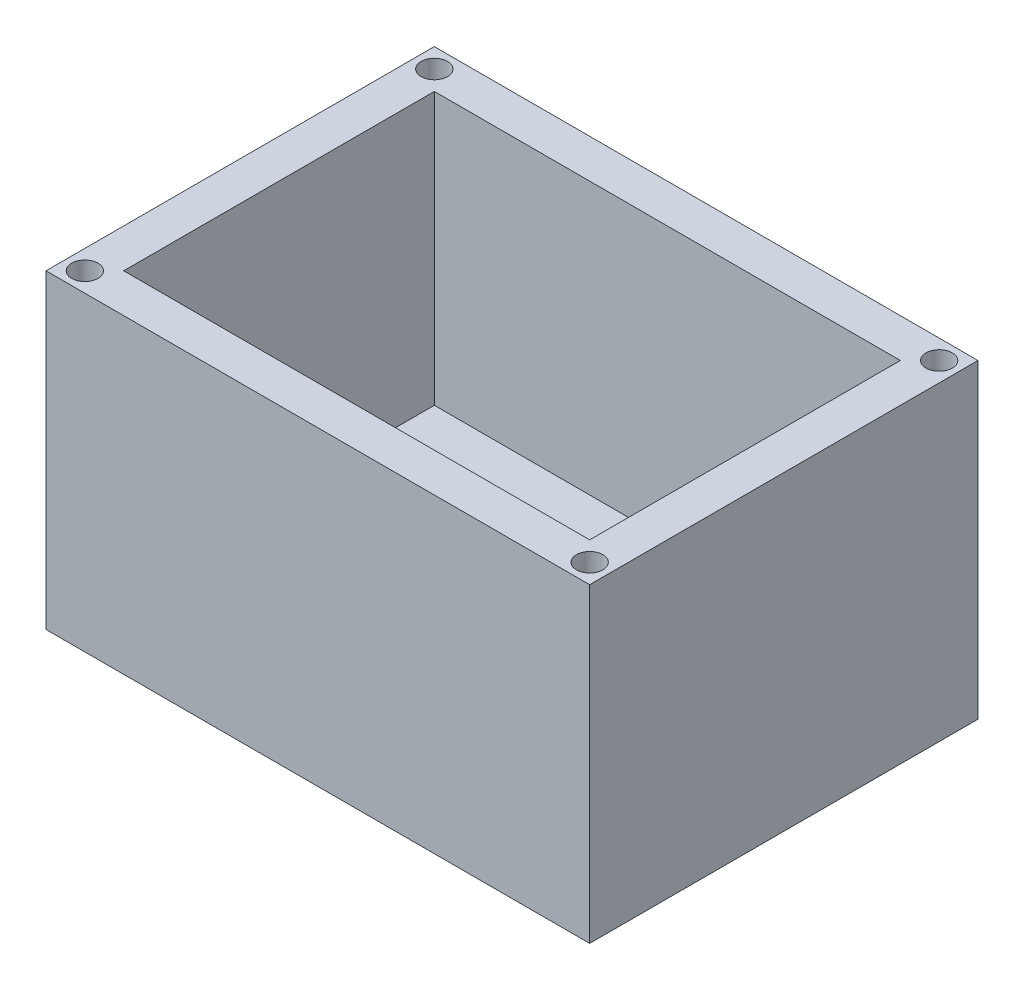
ISO-10303-21;
HEADER;
FILE_DESCRIPTION(('STEP AP214'),'2;1');
FILE_NAME('part.step','',(''),(''),'','','');
FILE_SCHEMA(('AUTOMOTIVE_DESIGN { 1 0 10303 214 1 1 1 1 }'));
ENDSEC;
DATA;
#1=APPLICATION_CONTEXT('core data for automotive mechanical design processes');
#2=APPLICATION_PROTOCOL_DEFINITION('international standard','automotive_design',2000,#1);
#3=PRODUCT_CONTEXT('',#1,'mechanical');
#4=PRODUCT('Part','Part','',(#3));
#5=PRODUCT_RELATED_PRODUCT_CATEGORY('part','',(#4));
#6=PRODUCT_DEFINITION_FORMATION('','',#4);
#7=PRODUCT_DEFINITION_CONTEXT('part definition',#1,'design');
#8=PRODUCT_DEFINITION('design','',#6,#7);
#9=PRODUCT_DEFINITION_SHAPE('','',#8);
#10=(LENGTH_UNIT() NAMED_UNIT(*) SI_UNIT(.MILLI.,.METRE.));
#11=(NAMED_UNIT(*) PLANE_ANGLE_UNIT() SI_UNIT($,.RADIAN.));
#12=(NAMED_UNIT(*) SI_UNIT($,.STERADIAN.) SOLID_ANGLE_UNIT());
#13=UNCERTAINTY_MEASURE_WITH_UNIT(LENGTH_MEASURE(1.E-05),#10,'distance_accuracy_value','');
#14=(GEOMETRIC_REPRESENTATION_CONTEXT(3) GLOBAL_UNCERTAINTY_ASSIGNED_CONTEXT((#13)) GLOBAL_UNIT_ASSIGNED_CONTEXT((#10,
#11,#12)) REPRESENTATION_CONTEXT('',''));
#15=CARTESIAN_POINT('',(0.,0.,0.));
#16=DIRECTION('',(0.,0.,1.));
#17=DIRECTION('',(1.,0.,0.));
#18=AXIS2_PLACEMENT_3D('',#15,#16,#17);
#19=CARTESIAN_POINT('',(0.,40.,0.));
#20=DIRECTION('',(0.,-1.,0.));
#21=DIRECTION('',(0.,0.,-1.));
#22=AXIS2_PLACEMENT_3D('',#19,#20,#21);
#23=PLANE('',#22);
#24=CARTESIAN_POINT('',(-22.4817193008492,40.,-11.7813638933177));
#25=DIRECTION('',(0.,1.,0.));
#26=DIRECTION('',(0.,0.,1.));
#27=AXIS2_PLACEMENT_3D('',#24,#25,#26);
#28=CIRCLE('',#27,1.7);
#29=CARTESIAN_POINT('',(-22.4817193008492,40.,-10.0813638933177));
#30=VERTEX_POINT('',#29);
#31=EDGE_CURVE('E129',#30,#30,#28,.T.);
#32=ORIENTED_EDGE('',*,*,#31,.F.);
#33=EDGE_LOOP('',(#32));
#34=FACE_BOUND('',#33,.T.);
#35=CARTESIAN_POINT('',(42.5182718238463,40.,-11.7813641264661));
#36=DIRECTION('',(0.,1.,0.));
#37=DIRECTION('',(0.,0.,1.));
#38=AXIS2_PLACEMENT_3D('',#35,#36,#37);
#39=CIRCLE('',#38,1.7);
#40=CARTESIAN_POINT('',(42.5182718238463,40.,-10.0813641264661));
#41=VERTEX_POINT('',#40);
#42=EDGE_CURVE('E128',#41,#41,#39,.T.);
#43=ORIENTED_EDGE('',*,*,#42,.F.);
#44=EDGE_LOOP('',(#43));
#45=FACE_BOUND('',#44,.T.);
#46=CARTESIAN_POINT('',(42.5182807559897,40.,33.2186374069588));
#47=DIRECTION('',(0.,1.,0.));
#48=DIRECTION('',(0.,0.,1.));
#49=AXIS2_PLACEMENT_3D('',#46,#47,#48);
#50=CIRCLE('',#49,1.7);
#51=CARTESIAN_POINT('',(42.5182807559897,40.,34.9186374069588));
#52=VERTEX_POINT('',#51);
#53=EDGE_CURVE('E142',#52,#52,#50,.T.);
#54=ORIENTED_EDGE('',*,*,#53,.F.);
#55=EDGE_LOOP('',(#54));
#56=FACE_BOUND('',#55,.T.);
#57=CARTESIAN_POINT('',(-22.4817182633575,40.,33.2186380861719));
#58=DIRECTION('',(0.,1.,0.));
#59=DIRECTION('',(0.,0.,1.));
#60=AXIS2_PLACEMENT_3D('',#57,#58,#59);
#61=CIRCLE('',#60,1.7);
#62=CARTESIAN_POINT('',(-22.4817182633575,40.,34.9186380861718));
#63=VERTEX_POINT('',#62);
#64=EDGE_CURVE('E150',#63,#63,#61,.T.);
#65=ORIENTED_EDGE('',*,*,#64,.F.);
#66=EDGE_LOOP('',(#65));
#67=FACE_BOUND('',#66,.T.);
#68=DIRECTION('',(0.,0.,1.));
#69=VECTOR('',#68,1.);
#70=CARTESIAN_POINT('',(-24.9817295980512,40.,-14.2813641900122));
#71=LINE('',#70,#69);
#72=CARTESIAN_POINT('',(-24.9817295980512,40.,-14.2813641900122));
#73=VERTEX_POINT('',#72);
#74=CARTESIAN_POINT('',(-24.9817295980511,40.,35.7186358099878));
#75=VERTEX_POINT('',#74);
#76=EDGE_CURVE('E196',#73,#75,#71,.T.);
#77=ORIENTED_EDGE('',*,*,#76,.T.);
#78=DIRECTION('',(1.,0.,0.));
#79=VECTOR('',#78,1.);
#80=CARTESIAN_POINT('',(45.0182704019489,40.,35.7186358099878));
#81=LINE('',#80,#79);
#82=CARTESIAN_POINT('',(45.0182704019489,40.,35.7186358099878));
#83=VERTEX_POINT('',#82);
#84=EDGE_CURVE('E200',#75,#83,#81,.T.);
#85=ORIENTED_EDGE('',*,*,#84,.T.);
#86=DIRECTION('',(0.,0.,-1.));
#87=VECTOR('',#86,1.);
#88=CARTESIAN_POINT('',(45.0182704019488,40.,-14.2813641900122));
#89=LINE('',#88,#87);
#90=CARTESIAN_POINT('',(45.0182704019488,40.,-14.2813641900122));
#91=VERTEX_POINT('',#90);
#92=EDGE_CURVE('E204',#83,#91,#89,.T.);
#93=ORIENTED_EDGE('',*,*,#92,.T.);
#94=DIRECTION('',(-1.,0.,0.));
#95=VECTOR('',#94,1.);
#96=CARTESIAN_POINT('',(-24.9817295980512,40.,-14.2813641900122));
#97=LINE('',#96,#95);
#98=EDGE_CURVE('E207',#91,#73,#97,.T.);
#99=ORIENTED_EDGE('',*,*,#98,.T.);
#100=EDGE_LOOP('',(#77,#85,#93,#99));
#101=FACE_BOUND('',#100,.T.);
#102=DIRECTION('',(0.,0.,1.));
#103=VECTOR('',#102,1.);
#104=CARTESIAN_POINT('',(-19.9817295980511,40.,-9.28136419001218));
#105=LINE('',#104,#103);
#106=CARTESIAN_POINT('',(-19.9817295980511,40.,-9.28136419001218));
#107=VERTEX_POINT('',#106);
#108=CARTESIAN_POINT('',(-19.9817295980511,40.,30.7186358099878));
#109=VERTEX_POINT('',#108);
#110=EDGE_CURVE('E170',#107,#109,#105,.T.);
#111=ORIENTED_EDGE('',*,*,#110,.F.);
#112=DIRECTION('',(-1.,0.,0.));
#113=VECTOR('',#112,1.);
#114=CARTESIAN_POINT('',(-19.9817295980511,40.,-9.28136419001218));
#115=LINE('',#114,#113);
#116=CARTESIAN_POINT('',(40.0182704019489,40.,-9.28136419001218));
#117=VERTEX_POINT('',#116);
#118=EDGE_CURVE('E180',#117,#107,#115,.T.);
#119=ORIENTED_EDGE('',*,*,#118,.F.);
#120=DIRECTION('',(0.,0.,-1.));
#121=VECTOR('',#120,1.);
#122=CARTESIAN_POINT('',(40.0182704019489,40.,-9.28136419001218));
#123=LINE('',#122,#121);
#124=CARTESIAN_POINT('',(40.0182704019489,40.,30.7186358099878));
#125=VERTEX_POINT('',#124);
#126=EDGE_CURVE('E176',#125,#117,#123,.T.);
#127=ORIENTED_EDGE('',*,*,#126,.F.);
#128=DIRECTION('',(1.,0.,0.));
#129=VECTOR('',#128,1.);
#130=CARTESIAN_POINT('',(-19.9817295980511,40.,30.7186358099878));
#131=LINE('',#130,#129);
#132=EDGE_CURVE('E173',#109,#125,#131,.T.);
#133=ORIENTED_EDGE('',*,*,#132,.F.);
#134=EDGE_LOOP('',(#111,#119,#127,#133));
#135=FACE_BOUND('',#134,.T.);
#136=ADVANCED_FACE('F38',(#34,#45,#56,#67,#101,#135),#23,.F.);
#137=CARTESIAN_POINT('',(0.,0.,0.));
#138=DIRECTION('',(0.,-1.,0.));
#139=DIRECTION('',(0.,0.,-1.));
#140=AXIS2_PLACEMENT_3D('',#137,#138,#139);
#141=PLANE('',#140);
#142=DIRECTION('',(0.,0.,1.));
#143=VECTOR('',#142,1.);
#144=CARTESIAN_POINT('',(-24.9817295980512,0.,-14.2813641900122));
#145=LINE('',#144,#143);
#146=CARTESIAN_POINT('',(-24.9817295980512,0.,-14.2813641900122));
#147=VERTEX_POINT('',#146);
#148=CARTESIAN_POINT('',(-24.9817295980511,0.,35.7186358099878));
#149=VERTEX_POINT('',#148);
#150=EDGE_CURVE('E195',#147,#149,#145,.T.);
#151=ORIENTED_EDGE('',*,*,#150,.F.);
#152=DIRECTION('',(-1.,0.,0.));
#153=VECTOR('',#152,1.);
#154=CARTESIAN_POINT('',(-24.9817295980512,0.,-14.2813641900122));
#155=LINE('',#154,#153);
#156=CARTESIAN_POINT('',(45.0182704019488,0.,-14.2813641900122));
#157=VERTEX_POINT('',#156);
#158=EDGE_CURVE('E201',#157,#147,#155,.T.);
#159=ORIENTED_EDGE('',*,*,#158,.F.);
#160=DIRECTION('',(0.,0.,-1.));
#161=VECTOR('',#160,1.);
#162=CARTESIAN_POINT('',(45.0182704019488,0.,-14.2813641900122));
#163=LINE('',#162,#161);
#164=CARTESIAN_POINT('',(45.0182704019489,0.,35.7186358099878));
#165=VERTEX_POINT('',#164);
#166=EDGE_CURVE('E217',#165,#157,#163,.T.);
#167=ORIENTED_EDGE('',*,*,#166,.F.);
#168=DIRECTION('',(1.,0.,0.));
#169=VECTOR('',#168,1.);
#170=CARTESIAN_POINT('',(45.0182704019489,0.,35.7186358099878));
#171=LINE('',#170,#169);
#172=EDGE_CURVE('E214',#149,#165,#171,.T.);
#173=ORIENTED_EDGE('',*,*,#172,.F.);
#174=EDGE_LOOP('',(#151,#159,#167,#173));
#175=FACE_BOUND('',#174,.T.);
#176=ADVANCED_FACE('F240',(#175),#141,.T.);
#177=CARTESIAN_POINT('',(-24.9817295980512,40.,-14.2813641900122));
#178=DIRECTION('',(1.,0.,0.));
#179=DIRECTION('',(0.,0.,-1.));
#180=AXIS2_PLACEMENT_3D('',#177,#178,#179);
#181=PLANE('',#180);
#182=ORIENTED_EDGE('',*,*,#150,.T.);
#183=DIRECTION('',(0.,-1.,0.));
#184=VECTOR('',#183,1.);
#185=CARTESIAN_POINT('',(-24.9817295980511,40.,35.7186358099878));
#186=LINE('',#185,#184);
#187=EDGE_CURVE('E11',#75,#149,#186,.T.);
#188=ORIENTED_EDGE('',*,*,#187,.F.);
#189=ORIENTED_EDGE('',*,*,#76,.F.);
#190=DIRECTION('',(0.,-1.,0.));
#191=VECTOR('',#190,1.);
#192=CARTESIAN_POINT('',(-24.9817295980512,40.,-14.2813641900122));
#193=LINE('',#192,#191);
#194=EDGE_CURVE('E210',#73,#147,#193,.T.);
#195=ORIENTED_EDGE('',*,*,#194,.T.);
#196=EDGE_LOOP('',(#182,#188,#189,#195));
#197=FACE_BOUND('',#196,.T.);
#198=ADVANCED_FACE('F40',(#197),#181,.F.);
#199=CARTESIAN_POINT('',(45.0182704019489,40.,35.7186358099878));
#200=DIRECTION('',(0.,0.,-1.));
#201=DIRECTION('',(-1.,0.,0.));
#202=AXIS2_PLACEMENT_3D('',#199,#200,#201);
#203=PLANE('',#202);
#204=ORIENTED_EDGE('',*,*,#172,.T.);
#205=DIRECTION('',(0.,-1.,0.));
#206=VECTOR('',#205,1.);
#207=CARTESIAN_POINT('',(45.0182704019489,40.,35.7186358099878));
#208=LINE('',#207,#206);
#209=EDGE_CURVE('E47',#83,#165,#208,.T.);
#210=ORIENTED_EDGE('',*,*,#209,.F.);
#211=ORIENTED_EDGE('',*,*,#84,.F.);
#212=ORIENTED_EDGE('',*,*,#187,.T.);
#213=EDGE_LOOP('',(#204,#210,#211,#212));
#214=FACE_BOUND('',#213,.T.);
#215=ADVANCED_FACE('F250',(#214),#203,.F.);
#216=CARTESIAN_POINT('',(45.0182704019488,40.,-14.2813641900122));
#217=DIRECTION('',(-1.,0.,0.));
#218=DIRECTION('',(0.,0.,1.));
#219=AXIS2_PLACEMENT_3D('',#216,#217,#218);
#220=PLANE('',#219);
#221=ORIENTED_EDGE('',*,*,#166,.T.);
#222=DIRECTION('',(0.,-1.,0.));
#223=VECTOR('',#222,1.);
#224=CARTESIAN_POINT('',(45.0182704019488,40.,-14.2813641900122));
#225=LINE('',#224,#223);
#226=EDGE_CURVE('E225',#91,#157,#225,.T.);
#227=ORIENTED_EDGE('',*,*,#226,.F.);
#228=ORIENTED_EDGE('',*,*,#92,.F.);
#229=ORIENTED_EDGE('',*,*,#209,.T.);
#230=EDGE_LOOP('',(#221,#227,#228,#229));
#231=FACE_BOUND('',#230,.T.);
#232=ADVANCED_FACE('F234',(#231),#220,.F.);
#233=CARTESIAN_POINT('',(-24.9817295980512,40.,-14.2813641900122));
#234=DIRECTION('',(0.,0.,1.));
#235=DIRECTION('',(1.,0.,0.));
#236=AXIS2_PLACEMENT_3D('',#233,#234,#235);
#237=PLANE('',#236);
#238=ORIENTED_EDGE('',*,*,#158,.T.);
#239=ORIENTED_EDGE('',*,*,#194,.F.);
#240=ORIENTED_EDGE('',*,*,#98,.F.);
#241=ORIENTED_EDGE('',*,*,#226,.T.);
#242=EDGE_LOOP('',(#238,#239,#240,#241));
#243=FACE_BOUND('',#242,.T.);
#244=ADVANCED_FACE('F243',(#243),#237,.F.);
#245=CARTESIAN_POINT('',(-19.9817295980511,40.,-9.28136419001218));
#246=DIRECTION('',(1.,0.,0.));
#247=DIRECTION('',(0.,0.,-1.));
#248=AXIS2_PLACEMENT_3D('',#245,#246,#247);
#249=PLANE('',#248);
#250=DIRECTION('',(0.,0.,1.));
#251=VECTOR('',#250,1.);
#252=CARTESIAN_POINT('',(-19.9817295980511,5.,-9.28136419001218));
#253=LINE('',#252,#251);
#254=CARTESIAN_POINT('',(-19.9817295980511,5.,-9.28136419001218));
#255=VERTEX_POINT('',#254);
#256=CARTESIAN_POINT('',(-19.9817295980511,5.,30.7186358099878));
#257=VERTEX_POINT('',#256);
#258=EDGE_CURVE('E158',#255,#257,#253,.T.);
#259=ORIENTED_EDGE('',*,*,#258,.F.);
#260=DIRECTION('',(0.,-1.,0.));
#261=VECTOR('',#260,1.);
#262=CARTESIAN_POINT('',(-19.9817295980511,40.,-9.28136419001218));
#263=LINE('',#262,#261);
#264=EDGE_CURVE('E183',#107,#255,#263,.T.);
#265=ORIENTED_EDGE('',*,*,#264,.F.);
#266=ORIENTED_EDGE('',*,*,#110,.T.);
#267=DIRECTION('',(0.,-1.,0.));
#268=VECTOR('',#267,1.);
#269=CARTESIAN_POINT('',(-19.9817295980511,40.,30.7186358099878));
#270=LINE('',#269,#268);
#271=EDGE_CURVE('E192',#109,#257,#270,.T.);
#272=ORIENTED_EDGE('',*,*,#271,.T.);
#273=EDGE_LOOP('',(#259,#265,#266,#272));
#274=FACE_BOUND('',#273,.T.);
#275=ADVANCED_FACE('F269',(#274),#249,.T.);
#276=CARTESIAN_POINT('',(-19.9817295980511,40.,30.7186358099878));
#277=DIRECTION('',(0.,0.,-1.));
#278=DIRECTION('',(-1.,0.,0.));
#279=AXIS2_PLACEMENT_3D('',#276,#277,#278);
#280=PLANE('',#279);
#281=DIRECTION('',(1.,0.,0.));
#282=VECTOR('',#281,1.);
#283=CARTESIAN_POINT('',(-19.9817295980511,5.,30.7186358099878));
#284=LINE('',#283,#282);
#285=CARTESIAN_POINT('',(40.0182704019489,5.,30.7186358099878));
#286=VERTEX_POINT('',#285);
#287=EDGE_CURVE('E54',#257,#286,#284,.T.);
#288=ORIENTED_EDGE('',*,*,#287,.F.);
#289=ORIENTED_EDGE('',*,*,#271,.F.);
#290=ORIENTED_EDGE('',*,*,#132,.T.);
#291=DIRECTION('',(0.,-1.,0.));
#292=VECTOR('',#291,1.);
#293=CARTESIAN_POINT('',(40.0182704019489,40.,30.7186358099878));
#294=LINE('',#293,#292);
#295=EDGE_CURVE('E189',#125,#286,#294,.T.);
#296=ORIENTED_EDGE('',*,*,#295,.T.);
#297=EDGE_LOOP('',(#288,#289,#290,#296));
#298=FACE_BOUND('',#297,.T.);
#299=ADVANCED_FACE('F276',(#298),#280,.T.);
#300=CARTESIAN_POINT('',(40.0182704019489,40.,-9.28136419001218));
#301=DIRECTION('',(-1.,0.,0.));
#302=DIRECTION('',(0.,0.,1.));
#303=AXIS2_PLACEMENT_3D('',#300,#301,#302);
#304=PLANE('',#303);
#305=DIRECTION('',(0.,0.,-1.));
#306=VECTOR('',#305,1.);
#307=CARTESIAN_POINT('',(40.0182704019489,5.,-9.28136419001218));
#308=LINE('',#307,#306);
#309=CARTESIAN_POINT('',(40.0182704019489,5.,-9.28136419001218));
#310=VERTEX_POINT('',#309);
#311=EDGE_CURVE('E62',#286,#310,#308,.T.);
#312=ORIENTED_EDGE('',*,*,#311,.F.);
#313=ORIENTED_EDGE('',*,*,#295,.F.);
#314=ORIENTED_EDGE('',*,*,#126,.T.);
#315=DIRECTION('',(0.,-1.,0.));
#316=VECTOR('',#315,1.);
#317=CARTESIAN_POINT('',(40.0182704019489,40.,-9.28136419001218));
#318=LINE('',#317,#316);
#319=EDGE_CURVE('E186',#117,#310,#318,.T.);
#320=ORIENTED_EDGE('',*,*,#319,.T.);
#321=EDGE_LOOP('',(#312,#313,#314,#320));
#322=FACE_BOUND('',#321,.T.);
#323=ADVANCED_FACE('F281',(#322),#304,.T.);
#324=CARTESIAN_POINT('',(-19.9817295980511,40.,-9.28136419001218));
#325=DIRECTION('',(0.,0.,1.));
#326=DIRECTION('',(1.,0.,0.));
#327=AXIS2_PLACEMENT_3D('',#324,#325,#326);
#328=PLANE('',#327);
#329=DIRECTION('',(-1.,0.,0.));
#330=VECTOR('',#329,1.);
#331=CARTESIAN_POINT('',(-19.9817295980511,5.,-9.28136419001218));
#332=LINE('',#331,#330);
#333=EDGE_CURVE('E166',#310,#255,#332,.T.);
#334=ORIENTED_EDGE('',*,*,#333,.F.);
#335=ORIENTED_EDGE('',*,*,#319,.F.);
#336=ORIENTED_EDGE('',*,*,#118,.T.);
#337=ORIENTED_EDGE('',*,*,#264,.T.);
#338=EDGE_LOOP('',(#334,#335,#336,#337));
#339=FACE_BOUND('',#338,.T.);
#340=ADVANCED_FACE('F288',(#339),#328,.T.);
#341=CARTESIAN_POINT('',(0.,5.,0.));
#342=DIRECTION('',(0.,1.,0.));
#343=DIRECTION('',(0.,0.,1.));
#344=AXIS2_PLACEMENT_3D('',#341,#342,#343);
#345=PLANE('',#344);
#346=ORIENTED_EDGE('',*,*,#258,.T.);
#347=ORIENTED_EDGE('',*,*,#287,.T.);
#348=ORIENTED_EDGE('',*,*,#311,.T.);
#349=ORIENTED_EDGE('',*,*,#333,.T.);
#350=EDGE_LOOP('',(#346,#347,#348,#349));
#351=FACE_BOUND('',#350,.T.);
#352=ADVANCED_FACE('F286',(#351),#345,.T.);
#353=CARTESIAN_POINT('',(-22.4817182633575,20.,33.2186380861719));
#354=DIRECTION('',(0.,1.,0.));
#355=DIRECTION('',(0.,0.,1.));
#356=AXIS2_PLACEMENT_3D('',#353,#354,#355);
#357=CONICAL_SURFACE('',#356,1.7,1.02974425867665);
#358=CARTESIAN_POINT('',(-22.4817182633575,18.9785369476531,33.2186380861719));
#359=VERTEX_POINT('',#358);
#360=VERTEX_LOOP('',#359);
#361=FACE_BOUND('',#360,.T.);
#362=CARTESIAN_POINT('',(-22.4817182633575,20.,33.2186380861719));
#363=DIRECTION('',(0.,1.,0.));
#364=DIRECTION('',(0.,0.,1.));
#365=AXIS2_PLACEMENT_3D('',#362,#363,#364);
#366=CIRCLE('',#365,1.7);
#367=CARTESIAN_POINT('',(-22.4817182633575,20.,34.9186380861718));
#368=VERTEX_POINT('',#367);
#369=EDGE_CURVE('E154',#368,#368,#366,.T.);
#370=ORIENTED_EDGE('',*,*,#369,.T.);
#371=EDGE_LOOP('',(#370));
#372=FACE_BOUND('',#371,.T.);
#373=ADVANCED_FACE('F301',(#361,#372),#357,.F.);
#374=CARTESIAN_POINT('',(-22.4817182633575,40.,33.2186380861719));
#375=DIRECTION('',(0.,1.,0.));
#376=DIRECTION('',(0.,0.,1.));
#377=AXIS2_PLACEMENT_3D('',#374,#375,#376);
#378=CYLINDRICAL_SURFACE('',#377,1.7);
#379=ORIENTED_EDGE('',*,*,#369,.F.);
#380=EDGE_LOOP('',(#379));
#381=FACE_BOUND('',#380,.T.);
#382=ORIENTED_EDGE('',*,*,#64,.T.);
#383=EDGE_LOOP('',(#382));
#384=FACE_BOUND('',#383,.T.);
#385=ADVANCED_FACE('F304',(#381,#384),#378,.F.);
#386=CARTESIAN_POINT('',(42.5182807559897,20.,33.2186374069588));
#387=DIRECTION('',(0.,1.,0.));
#388=DIRECTION('',(0.,0.,1.));
#389=AXIS2_PLACEMENT_3D('',#386,#387,#388);
#390=CONICAL_SURFACE('',#389,1.69999999999999,1.02974425867665);
#391=CARTESIAN_POINT('',(42.5182807559897,18.9785369476531,33.2186374069588));
#392=VERTEX_POINT('',#391);
#393=VERTEX_LOOP('',#392);
#394=FACE_BOUND('',#393,.T.);
#395=CARTESIAN_POINT('',(42.5182807559897,20.,33.2186374069588));
#396=DIRECTION('',(0.,1.,0.));
#397=DIRECTION('',(0.,0.,1.));
#398=AXIS2_PLACEMENT_3D('',#395,#396,#397);
#399=CIRCLE('',#398,1.69999999999999);
#400=CARTESIAN_POINT('',(42.5182807559897,20.,34.9186374069587));
#401=VERTEX_POINT('',#400);
#402=EDGE_CURVE('E146',#401,#401,#399,.T.);
#403=ORIENTED_EDGE('',*,*,#402,.T.);
#404=EDGE_LOOP('',(#403));
#405=FACE_BOUND('',#404,.T.);
#406=ADVANCED_FACE('F308',(#394,#405),#390,.F.);
#407=CARTESIAN_POINT('',(42.5182807559897,40.,33.2186374069588));
#408=DIRECTION('',(0.,1.,0.));
#409=DIRECTION('',(0.,0.,1.));
#410=AXIS2_PLACEMENT_3D('',#407,#408,#409);
#411=CYLINDRICAL_SURFACE('',#410,1.7);
#412=ORIENTED_EDGE('',*,*,#402,.F.);
#413=EDGE_LOOP('',(#412));
#414=FACE_BOUND('',#413,.T.);
#415=ORIENTED_EDGE('',*,*,#53,.T.);
#416=EDGE_LOOP('',(#415));
#417=FACE_BOUND('',#416,.T.);
#418=ADVANCED_FACE('F312',(#414,#417),#411,.F.);
#419=CARTESIAN_POINT('',(42.5182718238463,20.,-11.7813641264661));
#420=DIRECTION('',(0.,1.,0.));
#421=DIRECTION('',(0.,0.,1.));
#422=AXIS2_PLACEMENT_3D('',#419,#420,#421);
#423=CONICAL_SURFACE('',#422,1.69999999999999,1.02974425867665);
#424=CARTESIAN_POINT('',(42.5182718238463,18.9785369476531,-11.7813641264661));
#425=VERTEX_POINT('',#424);
#426=VERTEX_LOOP('',#425);
#427=FACE_BOUND('',#426,.T.);
#428=CARTESIAN_POINT('',(42.5182718238463,20.,-11.7813641264661));
#429=DIRECTION('',(0.,1.,0.));
#430=DIRECTION('',(0.,0.,1.));
#431=AXIS2_PLACEMENT_3D('',#428,#429,#430);
#432=CIRCLE('',#431,1.69999999999999);
#433=CARTESIAN_POINT('',(42.5182718238463,20.,-10.0813641264661));
#434=VERTEX_POINT('',#433);
#435=EDGE_CURVE('E134',#434,#434,#432,.T.);
#436=ORIENTED_EDGE('',*,*,#435,.T.);
#437=EDGE_LOOP('',(#436));
#438=FACE_BOUND('',#437,.T.);
#439=ADVANCED_FACE('F316',(#427,#438),#423,.F.);
#440=CARTESIAN_POINT('',(42.5182718238463,40.,-11.7813641264661));
#441=DIRECTION('',(0.,1.,0.));
#442=DIRECTION('',(0.,0.,1.));
#443=AXIS2_PLACEMENT_3D('',#440,#441,#442);
#444=CYLINDRICAL_SURFACE('',#443,1.7);
#445=ORIENTED_EDGE('',*,*,#435,.F.);
#446=EDGE_LOOP('',(#445));
#447=FACE_BOUND('',#446,.T.);
#448=ORIENTED_EDGE('',*,*,#42,.T.);
#449=EDGE_LOOP('',(#448));
#450=FACE_BOUND('',#449,.T.);
#451=ADVANCED_FACE('F121',(#447,#450),#444,.F.);
#452=CARTESIAN_POINT('',(-22.4817193008492,20.,-11.7813638933177));
#453=DIRECTION('',(0.,1.,0.));
#454=DIRECTION('',(0.,0.,1.));
#455=AXIS2_PLACEMENT_3D('',#452,#453,#454);
#456=CONICAL_SURFACE('',#455,1.69999999999999,1.02974425867665);
#457=CARTESIAN_POINT('',(-22.4817193008492,18.9785369476531,-11.7813638933177));
#458=VERTEX_POINT('',#457);
#459=VERTEX_LOOP('',#458);
#460=FACE_BOUND('',#459,.T.);
#461=CARTESIAN_POINT('',(-22.4817193008492,20.,-11.7813638933177));
#462=DIRECTION('',(0.,1.,0.));
#463=DIRECTION('',(0.,0.,1.));
#464=AXIS2_PLACEMENT_3D('',#461,#462,#463);
#465=CIRCLE('',#464,1.69999999999999);
#466=CARTESIAN_POINT('',(-22.4817193008492,20.,-10.0813638933177));
#467=VERTEX_POINT('',#466);
#468=EDGE_CURVE('E125',#467,#467,#465,.T.);
#469=ORIENTED_EDGE('',*,*,#468,.T.);
#470=EDGE_LOOP('',(#469));
#471=FACE_BOUND('',#470,.T.);
#472=ADVANCED_FACE('F117',(#460,#471),#456,.F.);
#473=CARTESIAN_POINT('',(-22.4817193008492,40.,-11.7813638933177));
#474=DIRECTION('',(0.,1.,0.));
#475=DIRECTION('',(0.,0.,1.));
#476=AXIS2_PLACEMENT_3D('',#473,#474,#475);
#477=CYLINDRICAL_SURFACE('',#476,1.69999999999999);
#478=ORIENTED_EDGE('',*,*,#468,.F.);
#479=EDGE_LOOP('',(#478));
#480=FACE_BOUND('',#479,.T.);
#481=ORIENTED_EDGE('',*,*,#31,.T.);
#482=EDGE_LOOP('',(#481));
#483=FACE_BOUND('',#482,.T.);
#484=ADVANCED_FACE('F120',(#480,#483),#477,.F.);
#485=CLOSED_SHELL('',(#136,#176,#198,#215,#232,#244,#275,#299,#323,#340,#352,#373,#385,#406,
#418,#439,#451,#472,#484));
#486=MANIFOLD_SOLID_BREP('B2',#485);
#487=ADVANCED_BREP_SHAPE_REPRESENTATION('',(#18,#486),#14);
#488=SHAPE_DEFINITION_REPRESENTATION(#9,#487);
ENDSEC;
END-ISO-10303-21;
